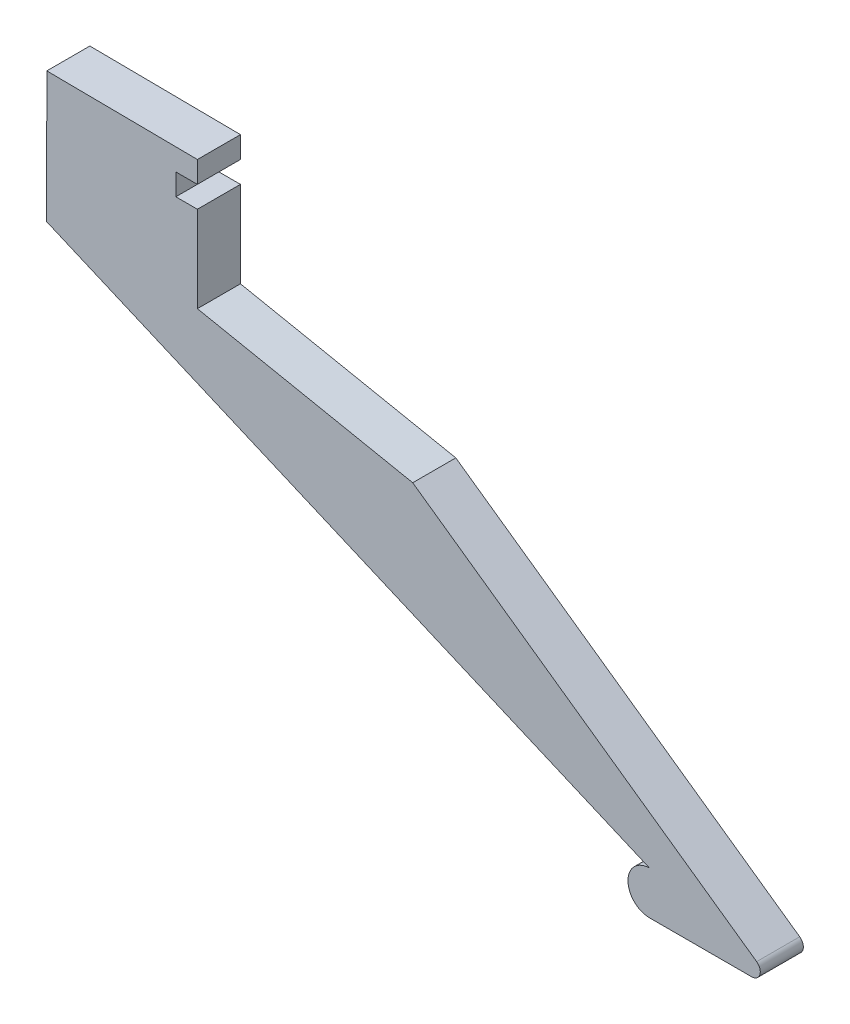
ISO-10303-21;
HEADER;
FILE_DESCRIPTION(('STEP AP214'),'2;1');
FILE_NAME('part.step','',(''),(''),'','','');
FILE_SCHEMA(('AUTOMOTIVE_DESIGN { 1 0 10303 214 1 1 1 1 }'));
ENDSEC;
DATA;
#1=APPLICATION_CONTEXT('core data for automotive mechanical design processes');
#2=APPLICATION_PROTOCOL_DEFINITION('international standard','automotive_design',2000,#1);
#3=PRODUCT_CONTEXT('',#1,'mechanical');
#4=PRODUCT('Part','Part','',(#3));
#5=PRODUCT_RELATED_PRODUCT_CATEGORY('part','',(#4));
#6=PRODUCT_DEFINITION_FORMATION('','',#4);
#7=PRODUCT_DEFINITION_CONTEXT('part definition',#1,'design');
#8=PRODUCT_DEFINITION('design','',#6,#7);
#9=PRODUCT_DEFINITION_SHAPE('','',#8);
#10=(LENGTH_UNIT() NAMED_UNIT(*) SI_UNIT(.MILLI.,.METRE.));
#11=(NAMED_UNIT(*) PLANE_ANGLE_UNIT() SI_UNIT($,.RADIAN.));
#12=(NAMED_UNIT(*) SI_UNIT($,.STERADIAN.) SOLID_ANGLE_UNIT());
#13=UNCERTAINTY_MEASURE_WITH_UNIT(LENGTH_MEASURE(1.E-05),#10,'distance_accuracy_value','');
#14=(GEOMETRIC_REPRESENTATION_CONTEXT(3) GLOBAL_UNCERTAINTY_ASSIGNED_CONTEXT((#13)) GLOBAL_UNIT_ASSIGNED_CONTEXT((#10,
#11,#12)) REPRESENTATION_CONTEXT('',''));
#15=CARTESIAN_POINT('',(0.,0.,0.));
#16=DIRECTION('',(0.,0.,1.));
#17=DIRECTION('',(1.,0.,0.));
#18=AXIS2_PLACEMENT_3D('',#15,#16,#17);
#19=CARTESIAN_POINT('',(-13.3703749851343,13.6087282524458,3.175));
#20=DIRECTION('',(-1.,0.,0.));
#21=DIRECTION('',(0.,0.,1.));
#22=AXIS2_PLACEMENT_3D('',#19,#20,#21);
#23=PLANE('',#22);
#24=DIRECTION('',(0.,0.,1.));
#25=VECTOR('',#24,1.);
#26=CARTESIAN_POINT('',(-13.3703749851343,19.9587282524459,0.));
#27=LINE('',#26,#25);
#28=CARTESIAN_POINT('',(-13.3703749851343,19.9587282524459,0.));
#29=VERTEX_POINT('',#28);
#30=CARTESIAN_POINT('',(-13.3703749851343,19.9587282524459,3.175));
#31=VERTEX_POINT('',#30);
#32=EDGE_CURVE('E226',#29,#31,#27,.T.);
#33=ORIENTED_EDGE('',*,*,#32,.T.);
#34=DIRECTION('',(0.,1.,0.));
#35=VECTOR('',#34,1.);
#36=CARTESIAN_POINT('',(-13.3703749851343,13.6087282524458,3.175));
#37=LINE('',#36,#35);
#38=CARTESIAN_POINT('',(-13.3703749851343,13.6087282524458,3.175));
#39=VERTEX_POINT('',#38);
#40=EDGE_CURVE('E154',#39,#31,#37,.T.);
#41=ORIENTED_EDGE('',*,*,#40,.F.);
#42=DIRECTION('',(0.,0.,-1.));
#43=VECTOR('',#42,1.);
#44=CARTESIAN_POINT('',(-13.3703749851343,13.6087282524458,3.175));
#45=LINE('',#44,#43);
#46=CARTESIAN_POINT('',(-13.3703749851343,13.6087282524458,0.));
#47=VERTEX_POINT('',#46);
#48=EDGE_CURVE('E148',#39,#47,#45,.T.);
#49=ORIENTED_EDGE('',*,*,#48,.T.);
#50=DIRECTION('',(0.,1.,0.));
#51=VECTOR('',#50,1.);
#52=CARTESIAN_POINT('',(-13.3703749851343,13.6087282524458,0.));
#53=LINE('',#52,#51);
#54=EDGE_CURVE('E176',#47,#29,#53,.T.);
#55=ORIENTED_EDGE('',*,*,#54,.T.);
#56=EDGE_LOOP('',(#33,#41,#49,#55));
#57=FACE_BOUND('',#56,.T.);
#58=ADVANCED_FACE('F38',(#57),#23,.F.);
#59=CARTESIAN_POINT('',(-24.4707937163703,23.2414275614635,3.175));
#60=DIRECTION('',(-0.00970181782261238,-0.999952936257971,0.));
#61=DIRECTION('',(0.999952936257971,-0.00970181782261238,0.));
#62=AXIS2_PLACEMENT_3D('',#59,#60,#61);
#63=PLANE('',#62);
#64=DIRECTION('',(-0.99995293625797,0.00970181782261238,0.));
#65=VECTOR('',#64,1.);
#66=CARTESIAN_POINT('',(-24.4707937163703,23.2414275614635,0.));
#67=LINE('',#66,#65);
#68=CARTESIAN_POINT('',(-13.3703749851343,23.1337282524458,0.));
#69=VERTEX_POINT('',#68);
#70=CARTESIAN_POINT('',(-24.4707937163703,23.2414275614635,0.));
#71=VERTEX_POINT('',#70);
#72=EDGE_CURVE('E159',#69,#71,#67,.T.);
#73=ORIENTED_EDGE('',*,*,#72,.T.);
#74=DIRECTION('',(0.,0.,-1.));
#75=VECTOR('',#74,1.);
#76=CARTESIAN_POINT('',(-24.4707937163703,23.2414275614635,3.175));
#77=LINE('',#76,#75);
#78=CARTESIAN_POINT('',(-24.4707937163703,23.2414275614635,3.175));
#79=VERTEX_POINT('',#78);
#80=EDGE_CURVE('E11',#79,#71,#77,.T.);
#81=ORIENTED_EDGE('',*,*,#80,.F.);
#82=DIRECTION('',(-0.99995293625797,0.00970181782261238,0.));
#83=VECTOR('',#82,1.);
#84=CARTESIAN_POINT('',(-24.4707937163703,23.2414275614635,3.175));
#85=LINE('',#84,#83);
#86=CARTESIAN_POINT('',(-13.3703749851343,23.1337282524458,3.175));
#87=VERTEX_POINT('',#86);
#88=EDGE_CURVE('E179',#87,#79,#85,.T.);
#89=ORIENTED_EDGE('',*,*,#88,.F.);
#90=DIRECTION('',(0.,0.,-1.));
#91=VECTOR('',#90,1.);
#92=CARTESIAN_POINT('',(-13.3703749851343,23.1337282524458,3.175));
#93=LINE('',#92,#91);
#94=EDGE_CURVE('E158',#87,#69,#93,.T.);
#95=ORIENTED_EDGE('',*,*,#94,.T.);
#96=EDGE_LOOP('',(#73,#81,#89,#95));
#97=FACE_BOUND('',#96,.T.);
#98=ADVANCED_FACE('F40',(#97),#63,.F.);
#99=CARTESIAN_POINT('',(-24.4707937163703,23.2414275614635,3.175));
#100=DIRECTION('',(0.999999213500273,-0.00125419250353213,0.));
#101=DIRECTION('',(0.00125419250353213,0.999999213500273,0.));
#102=AXIS2_PLACEMENT_3D('',#99,#100,#101);
#103=PLANE('',#102);
#104=DIRECTION('',(-0.00125419250353213,-0.999999213500273,0.));
#105=VECTOR('',#104,1.);
#106=CARTESIAN_POINT('',(-24.4707937163703,23.2414275614635,0.));
#107=LINE('',#106,#105);
#108=CARTESIAN_POINT('',(-24.4828749851343,13.6087282524458,0.));
#109=VERTEX_POINT('',#108);
#110=EDGE_CURVE('E162',#71,#109,#107,.T.);
#111=ORIENTED_EDGE('',*,*,#110,.T.);
#112=DIRECTION('',(0.,0.,-1.));
#113=VECTOR('',#112,1.);
#114=CARTESIAN_POINT('',(-24.4828749851343,13.6087282524458,3.175));
#115=LINE('',#114,#113);
#116=CARTESIAN_POINT('',(-24.4828749851343,13.6087282524458,3.175));
#117=VERTEX_POINT('',#116);
#118=EDGE_CURVE('E46',#117,#109,#115,.T.);
#119=ORIENTED_EDGE('',*,*,#118,.F.);
#120=DIRECTION('',(-0.00125419250353213,-0.999999213500273,0.));
#121=VECTOR('',#120,1.);
#122=CARTESIAN_POINT('',(-24.4707937163703,23.2414275614635,3.175));
#123=LINE('',#122,#121);
#124=EDGE_CURVE('E107',#79,#117,#123,.T.);
#125=ORIENTED_EDGE('',*,*,#124,.F.);
#126=ORIENTED_EDGE('',*,*,#80,.T.);
#127=EDGE_LOOP('',(#111,#119,#125,#126));
#128=FACE_BOUND('',#127,.T.);
#129=ADVANCED_FACE('F280',(#128),#103,.F.);
#130=CARTESIAN_POINT('',(-24.4828749851343,13.6087282524458,3.175));
#131=DIRECTION('',(0.393919298579168,0.919145030018058,0.));
#132=DIRECTION('',(-0.919145030018058,0.393919298579168,0.));
#133=AXIS2_PLACEMENT_3D('',#130,#131,#132);
#134=PLANE('',#133);
#135=DIRECTION('',(0.919145030018058,-0.393919298579168,0.));
#136=VECTOR('',#135,1.);
#137=CARTESIAN_POINT('',(-24.4828749851343,13.6087282524458,0.));
#138=LINE('',#137,#136);
#139=CARTESIAN_POINT('',(19.9671250148657,-5.44127174755415,0.));
#140=VERTEX_POINT('',#139);
#141=EDGE_CURVE('E165',#109,#140,#138,.T.);
#142=ORIENTED_EDGE('',*,*,#141,.T.);
#143=DIRECTION('',(0.,0.,-1.));
#144=VECTOR('',#143,1.);
#145=CARTESIAN_POINT('',(19.9671250148657,-5.44127174755415,3.175));
#146=LINE('',#145,#144);
#147=CARTESIAN_POINT('',(19.9671250148657,-5.44127174755415,3.175));
#148=VERTEX_POINT('',#147);
#149=EDGE_CURVE('E189',#148,#140,#146,.T.);
#150=ORIENTED_EDGE('',*,*,#149,.F.);
#151=DIRECTION('',(0.919145030018058,-0.393919298579168,0.));
#152=VECTOR('',#151,1.);
#153=CARTESIAN_POINT('',(-24.4828749851343,13.6087282524458,3.175));
#154=LINE('',#153,#152);
#155=EDGE_CURVE('E197',#117,#148,#154,.T.);
#156=ORIENTED_EDGE('',*,*,#155,.F.);
#157=ORIENTED_EDGE('',*,*,#118,.T.);
#158=EDGE_LOOP('',(#142,#150,#156,#157));
#159=FACE_BOUND('',#158,.T.);
#160=ADVANCED_FACE('F195',(#159),#134,.F.);
#161=CARTESIAN_POINT('',(19.9607324207735,-7.02877174755416,3.175));
#162=DIRECTION('',(0.,0.,-1.));
#163=DIRECTION('',(-1.,0.,0.));
#164=AXIS2_PLACEMENT_3D('',#161,#162,#163);
#165=CYLINDRICAL_SURFACE('',#164,1.58751287089561);
#166=CARTESIAN_POINT('',(19.9607324207735,-7.02877174755416,0.));
#167=DIRECTION('',(0.,0.,1.));
#168=DIRECTION('',(1.,0.,0.));
#169=AXIS2_PLACEMENT_3D('',#166,#167,#168);
#170=CIRCLE('',#169,1.58751287089561);
#171=CARTESIAN_POINT('',(19.9543398266813,-8.61627174755416,0.));
#172=VERTEX_POINT('',#171);
#173=EDGE_CURVE('E167',#140,#172,#170,.T.);
#174=ORIENTED_EDGE('',*,*,#173,.T.);
#175=DIRECTION('',(0.,0.,-1.));
#176=VECTOR('',#175,1.);
#177=CARTESIAN_POINT('',(19.9543398266813,-8.61627174755416,3.175));
#178=LINE('',#177,#176);
#179=CARTESIAN_POINT('',(19.9543398266813,-8.61627174755416,3.175));
#180=VERTEX_POINT('',#179);
#181=EDGE_CURVE('E186',#180,#172,#178,.T.);
#182=ORIENTED_EDGE('',*,*,#181,.F.);
#183=CARTESIAN_POINT('',(19.9607324207735,-7.02877174755416,3.175));
#184=DIRECTION('',(0.,0.,1.));
#185=DIRECTION('',(1.,0.,0.));
#186=AXIS2_PLACEMENT_3D('',#183,#184,#185);
#187=CIRCLE('',#186,1.58751287089561);
#188=EDGE_CURVE('E214',#148,#180,#187,.T.);
#189=ORIENTED_EDGE('',*,*,#188,.F.);
#190=ORIENTED_EDGE('',*,*,#149,.T.);
#191=EDGE_LOOP('',(#174,#182,#189,#190));
#192=FACE_BOUND('',#191,.T.);
#193=ADVANCED_FACE('F207',(#192),#165,.T.);
#194=CARTESIAN_POINT('',(19.9543398266813,-8.61627174755416,3.175));
#195=DIRECTION('',(0.,1.,0.));
#196=DIRECTION('',(-1.,0.,0.));
#197=AXIS2_PLACEMENT_3D('',#194,#195,#196);
#198=PLANE('',#197);
#199=DIRECTION('',(1.,0.,0.));
#200=VECTOR('',#199,1.);
#201=CARTESIAN_POINT('',(19.9543398266813,-8.61627174755416,0.));
#202=LINE('',#201,#200);
#203=CARTESIAN_POINT('',(27.4921250148657,-8.61627174755416,0.));
#204=VERTEX_POINT('',#203);
#205=EDGE_CURVE('E169',#172,#204,#202,.T.);
#206=ORIENTED_EDGE('',*,*,#205,.T.);
#207=DIRECTION('',(0.,0.,-1.));
#208=VECTOR('',#207,1.);
#209=CARTESIAN_POINT('',(27.4921250148657,-8.61627174755416,3.175));
#210=LINE('',#209,#208);
#211=CARTESIAN_POINT('',(27.4921250148657,-8.61627174755416,3.175));
#212=VERTEX_POINT('',#211);
#213=EDGE_CURVE('E183',#212,#204,#210,.T.);
#214=ORIENTED_EDGE('',*,*,#213,.F.);
#215=DIRECTION('',(1.,0.,0.));
#216=VECTOR('',#215,1.);
#217=CARTESIAN_POINT('',(19.9543398266813,-8.61627174755416,3.175));
#218=LINE('',#217,#216);
#219=EDGE_CURVE('E213',#180,#212,#218,.T.);
#220=ORIENTED_EDGE('',*,*,#219,.F.);
#221=ORIENTED_EDGE('',*,*,#181,.T.);
#222=EDGE_LOOP('',(#206,#214,#220,#221));
#223=FACE_BOUND('',#222,.T.);
#224=ADVANCED_FACE('F211',(#223),#198,.F.);
#225=CARTESIAN_POINT('',(27.4921250148657,-7.98149640644002,3.175));
#226=DIRECTION('',(0.,0.,-1.));
#227=DIRECTION('',(-1.,0.,0.));
#228=AXIS2_PLACEMENT_3D('',#225,#226,#227);
#229=CYLINDRICAL_SURFACE('',#228,0.634775341114138);
#230=CARTESIAN_POINT('',(27.4921250148657,-7.98149640644002,0.));
#231=DIRECTION('',(0.,0.,1.));
#232=DIRECTION('',(-1.,0.,0.));
#233=AXIS2_PLACEMENT_3D('',#230,#231,#232);
#234=CIRCLE('',#233,0.634775341114138);
#235=CARTESIAN_POINT('',(27.8581892883361,-7.46290535235684,0.));
#236=VERTEX_POINT('',#235);
#237=EDGE_CURVE('E171',#204,#236,#234,.T.);
#238=ORIENTED_EDGE('',*,*,#237,.T.);
#239=DIRECTION('',(0.,0.,-1.));
#240=VECTOR('',#239,1.);
#241=CARTESIAN_POINT('',(27.8581892883361,-7.46290535235684,3.175));
#242=LINE('',#241,#240);
#243=CARTESIAN_POINT('',(27.8581892883361,-7.46290535235684,3.175));
#244=VERTEX_POINT('',#243);
#245=EDGE_CURVE('E147',#244,#236,#242,.T.);
#246=ORIENTED_EDGE('',*,*,#245,.F.);
#247=CARTESIAN_POINT('',(27.4921250148657,-7.98149640644002,3.175));
#248=DIRECTION('',(0.,0.,1.));
#249=DIRECTION('',(-1.,0.,0.));
#250=AXIS2_PLACEMENT_3D('',#247,#248,#249);
#251=CIRCLE('',#250,0.634775341114138);
#252=EDGE_CURVE('E135',#212,#244,#251,.T.);
#253=ORIENTED_EDGE('',*,*,#252,.F.);
#254=ORIENTED_EDGE('',*,*,#213,.T.);
#255=EDGE_LOOP('',(#238,#246,#253,#254));
#256=FACE_BOUND('',#255,.T.);
#257=ADVANCED_FACE('F293',(#256),#229,.T.);
#258=CARTESIAN_POINT('',(2.50462501486565,10.4337282524458,3.175));
#259=DIRECTION('',(-0.576683197598655,-0.816967863264762,0.));
#260=DIRECTION('',(0.816967863264762,-0.576683197598655,0.));
#261=AXIS2_PLACEMENT_3D('',#258,#259,#260);
#262=PLANE('',#261);
#263=DIRECTION('',(-0.816967863264762,0.576683197598655,0.));
#264=VECTOR('',#263,1.);
#265=CARTESIAN_POINT('',(2.50462501486565,10.4337282524458,0.));
#266=LINE('',#265,#264);
#267=CARTESIAN_POINT('',(2.50462501486565,10.4337282524458,0.));
#268=VERTEX_POINT('',#267);
#269=EDGE_CURVE('E144',#236,#268,#266,.T.);
#270=ORIENTED_EDGE('',*,*,#269,.T.);
#271=DIRECTION('',(0.,0.,-1.));
#272=VECTOR('',#271,1.);
#273=CARTESIAN_POINT('',(2.50462501486565,10.4337282524458,3.175));
#274=LINE('',#273,#272);
#275=CARTESIAN_POINT('',(2.50462501486565,10.4337282524458,3.175));
#276=VERTEX_POINT('',#275);
#277=EDGE_CURVE('E141',#276,#268,#274,.T.);
#278=ORIENTED_EDGE('',*,*,#277,.F.);
#279=DIRECTION('',(-0.816967863264762,0.576683197598655,0.));
#280=VECTOR('',#279,1.);
#281=CARTESIAN_POINT('',(2.50462501486565,10.4337282524458,3.175));
#282=LINE('',#281,#280);
#283=EDGE_CURVE('E126',#244,#276,#282,.T.);
#284=ORIENTED_EDGE('',*,*,#283,.F.);
#285=ORIENTED_EDGE('',*,*,#245,.T.);
#286=EDGE_LOOP('',(#270,#278,#284,#285));
#287=FACE_BOUND('',#286,.T.);
#288=ADVANCED_FACE('F142',(#287),#262,.F.);
#289=CARTESIAN_POINT('',(-13.3703749851343,13.6087282524458,3.175));
#290=DIRECTION('',(-0.196116135138184,-0.98058067569092,0.));
#291=DIRECTION('',(0.98058067569092,-0.196116135138184,0.));
#292=AXIS2_PLACEMENT_3D('',#289,#290,#291);
#293=PLANE('',#292);
#294=DIRECTION('',(-0.98058067569092,0.196116135138184,0.));
#295=VECTOR('',#294,1.);
#296=CARTESIAN_POINT('',(-13.3703749851343,13.6087282524458,0.));
#297=LINE('',#296,#295);
#298=EDGE_CURVE('E174',#268,#47,#297,.T.);
#299=ORIENTED_EDGE('',*,*,#298,.T.);
#300=ORIENTED_EDGE('',*,*,#48,.F.);
#301=DIRECTION('',(-0.98058067569092,0.196116135138184,0.));
#302=VECTOR('',#301,1.);
#303=CARTESIAN_POINT('',(-13.3703749851343,13.6087282524458,3.175));
#304=LINE('',#303,#302);
#305=EDGE_CURVE('E132',#276,#39,#304,.T.);
#306=ORIENTED_EDGE('',*,*,#305,.F.);
#307=ORIENTED_EDGE('',*,*,#277,.T.);
#308=EDGE_LOOP('',(#299,#300,#306,#307));
#309=FACE_BOUND('',#308,.T.);
#310=ADVANCED_FACE('F150',(#309),#293,.F.);
#311=CARTESIAN_POINT('',(-13.3703749851343,21.5462282524459,3.175));
#312=VERTEX_POINT('',#311);
#313=EDGE_CURVE('E62',#312,#87,#37,.T.);
#314=ORIENTED_EDGE('',*,*,#313,.F.);
#315=DIRECTION('',(0.,0.,1.));
#316=VECTOR('',#315,1.);
#317=CARTESIAN_POINT('',(-13.3703749851343,21.5462282524459,0.));
#318=LINE('',#317,#316);
#319=CARTESIAN_POINT('',(-13.3703749851343,21.5462282524459,0.));
#320=VERTEX_POINT('',#319);
#321=EDGE_CURVE('E163',#320,#312,#318,.T.);
#322=ORIENTED_EDGE('',*,*,#321,.F.);
#323=EDGE_CURVE('E99',#320,#69,#53,.T.);
#324=ORIENTED_EDGE('',*,*,#323,.T.);
#325=ORIENTED_EDGE('',*,*,#94,.F.);
#326=EDGE_LOOP('',(#314,#322,#324,#325));
#327=FACE_BOUND('',#326,.T.);
#328=ADVANCED_FACE('F253',(#327),#23,.F.);
#329=CARTESIAN_POINT('',(27.4921250148657,-7.98149640644002,3.175));
#330=DIRECTION('',(0.,0.,-1.));
#331=DIRECTION('',(-1.,0.,0.));
#332=AXIS2_PLACEMENT_3D('',#329,#330,#331);
#333=PLANE('',#332);
#334=DIRECTION('',(0.,-1.,0.));
#335=VECTOR('',#334,1.);
#336=CARTESIAN_POINT('',(-14.9578749851343,0.,3.175));
#337=LINE('',#336,#335);
#338=CARTESIAN_POINT('',(-14.9578749851343,21.5462282524459,3.175));
#339=VERTEX_POINT('',#338);
#340=CARTESIAN_POINT('',(-14.9578749851343,19.9587282524459,3.175));
#341=VERTEX_POINT('',#340);
#342=EDGE_CURVE('E235',#339,#341,#337,.T.);
#343=ORIENTED_EDGE('',*,*,#342,.F.);
#344=DIRECTION('',(-1.,0.,0.));
#345=VECTOR('',#344,1.);
#346=CARTESIAN_POINT('',(0.,21.5462282524459,3.175));
#347=LINE('',#346,#345);
#348=EDGE_CURVE('E237',#312,#339,#347,.T.);
#349=ORIENTED_EDGE('',*,*,#348,.F.);
#350=ORIENTED_EDGE('',*,*,#313,.T.);
#351=ORIENTED_EDGE('',*,*,#88,.T.);
#352=ORIENTED_EDGE('',*,*,#124,.T.);
#353=ORIENTED_EDGE('',*,*,#155,.T.);
#354=ORIENTED_EDGE('',*,*,#188,.T.);
#355=ORIENTED_EDGE('',*,*,#219,.T.);
#356=ORIENTED_EDGE('',*,*,#252,.T.);
#357=ORIENTED_EDGE('',*,*,#283,.T.);
#358=ORIENTED_EDGE('',*,*,#305,.T.);
#359=ORIENTED_EDGE('',*,*,#40,.T.);
#360=DIRECTION('',(-1.,0.,0.));
#361=VECTOR('',#360,1.);
#362=CARTESIAN_POINT('',(0.,19.9587282524459,3.175));
#363=LINE('',#362,#361);
#364=EDGE_CURVE('E231',#31,#341,#363,.T.);
#365=ORIENTED_EDGE('',*,*,#364,.T.);
#366=EDGE_LOOP('',(#343,#349,#350,#351,#352,#353,#354,#355,#356,#357,#358,#359,#365));
#367=FACE_BOUND('',#366,.T.);
#368=ADVANCED_FACE('F129',(#367),#333,.F.);
#369=CARTESIAN_POINT('',(27.4921250148657,-7.98149640644002,0.));
#370=DIRECTION('',(0.,0.,-1.));
#371=DIRECTION('',(-1.,0.,0.));
#372=AXIS2_PLACEMENT_3D('',#369,#370,#371);
#373=PLANE('',#372);
#374=DIRECTION('',(-1.,0.,0.));
#375=VECTOR('',#374,1.);
#376=CARTESIAN_POINT('',(0.,21.5462282524459,0.));
#377=LINE('',#376,#375);
#378=CARTESIAN_POINT('',(-14.9578749851343,21.5462282524459,0.));
#379=VERTEX_POINT('',#378);
#380=EDGE_CURVE('E234',#320,#379,#377,.T.);
#381=ORIENTED_EDGE('',*,*,#380,.T.);
#382=DIRECTION('',(0.,-1.,0.));
#383=VECTOR('',#382,1.);
#384=CARTESIAN_POINT('',(-14.9578749851343,0.,0.));
#385=LINE('',#384,#383);
#386=CARTESIAN_POINT('',(-14.9578749851343,19.9587282524459,0.));
#387=VERTEX_POINT('',#386);
#388=EDGE_CURVE('E241',#379,#387,#385,.T.);
#389=ORIENTED_EDGE('',*,*,#388,.T.);
#390=DIRECTION('',(-1.,0.,0.));
#391=VECTOR('',#390,1.);
#392=CARTESIAN_POINT('',(0.,19.9587282524459,0.));
#393=LINE('',#392,#391);
#394=EDGE_CURVE('E224',#29,#387,#393,.T.);
#395=ORIENTED_EDGE('',*,*,#394,.F.);
#396=ORIENTED_EDGE('',*,*,#54,.F.);
#397=ORIENTED_EDGE('',*,*,#298,.F.);
#398=ORIENTED_EDGE('',*,*,#269,.F.);
#399=ORIENTED_EDGE('',*,*,#237,.F.);
#400=ORIENTED_EDGE('',*,*,#205,.F.);
#401=ORIENTED_EDGE('',*,*,#173,.F.);
#402=ORIENTED_EDGE('',*,*,#141,.F.);
#403=ORIENTED_EDGE('',*,*,#110,.F.);
#404=ORIENTED_EDGE('',*,*,#72,.F.);
#405=ORIENTED_EDGE('',*,*,#323,.F.);
#406=EDGE_LOOP('',(#381,#389,#395,#396,#397,#398,#399,#400,#401,#402,#403,#404,#405));
#407=FACE_BOUND('',#406,.T.);
#408=ADVANCED_FACE('F201',(#407),#373,.T.);
#409=CARTESIAN_POINT('',(0.,21.5462282524459,0.));
#410=DIRECTION('',(0.,1.,0.));
#411=DIRECTION('',(0.,0.,1.));
#412=AXIS2_PLACEMENT_3D('',#409,#410,#411);
#413=PLANE('',#412);
#414=ORIENTED_EDGE('',*,*,#348,.T.);
#415=DIRECTION('',(0.,0.,1.));
#416=VECTOR('',#415,1.);
#417=CARTESIAN_POINT('',(-14.9578749851343,21.5462282524459,0.));
#418=LINE('',#417,#416);
#419=EDGE_CURVE('E221',#379,#339,#418,.T.);
#420=ORIENTED_EDGE('',*,*,#419,.F.);
#421=ORIENTED_EDGE('',*,*,#380,.F.);
#422=ORIENTED_EDGE('',*,*,#321,.T.);
#423=EDGE_LOOP('',(#414,#420,#421,#422));
#424=FACE_BOUND('',#423,.T.);
#425=ADVANCED_FACE('F251',(#424),#413,.F.);
#426=CARTESIAN_POINT('',(0.,19.9587282524459,0.));
#427=DIRECTION('',(0.,1.,0.));
#428=DIRECTION('',(0.,0.,1.));
#429=AXIS2_PLACEMENT_3D('',#426,#427,#428);
#430=PLANE('',#429);
#431=ORIENTED_EDGE('',*,*,#364,.F.);
#432=ORIENTED_EDGE('',*,*,#32,.F.);
#433=ORIENTED_EDGE('',*,*,#394,.T.);
#434=DIRECTION('',(0.,0.,1.));
#435=VECTOR('',#434,1.);
#436=CARTESIAN_POINT('',(-14.9578749851343,19.9587282524459,0.));
#437=LINE('',#436,#435);
#438=EDGE_CURVE('E53',#387,#341,#437,.T.);
#439=ORIENTED_EDGE('',*,*,#438,.T.);
#440=EDGE_LOOP('',(#431,#432,#433,#439));
#441=FACE_BOUND('',#440,.T.);
#442=ADVANCED_FACE('F264',(#441),#430,.T.);
#443=CARTESIAN_POINT('',(-14.9578749851343,0.,0.));
#444=DIRECTION('',(-1.,0.,0.));
#445=DIRECTION('',(0.,0.,1.));
#446=AXIS2_PLACEMENT_3D('',#443,#444,#445);
#447=PLANE('',#446);
#448=ORIENTED_EDGE('',*,*,#342,.T.);
#449=ORIENTED_EDGE('',*,*,#438,.F.);
#450=ORIENTED_EDGE('',*,*,#388,.F.);
#451=ORIENTED_EDGE('',*,*,#419,.T.);
#452=EDGE_LOOP('',(#448,#449,#450,#451));
#453=FACE_BOUND('',#452,.T.);
#454=ADVANCED_FACE('F267',(#453),#447,.F.);
#455=CLOSED_SHELL('',(#58,#98,#129,#160,#193,#224,#257,#288,#310,#328,#368,#408,#425,#442,#454));
#456=MANIFOLD_SOLID_BREP('B2',#455);
#457=ADVANCED_BREP_SHAPE_REPRESENTATION('',(#18,#456),#14);
#458=SHAPE_DEFINITION_REPRESENTATION(#9,#457);
ENDSEC;
END-ISO-10303-21;
